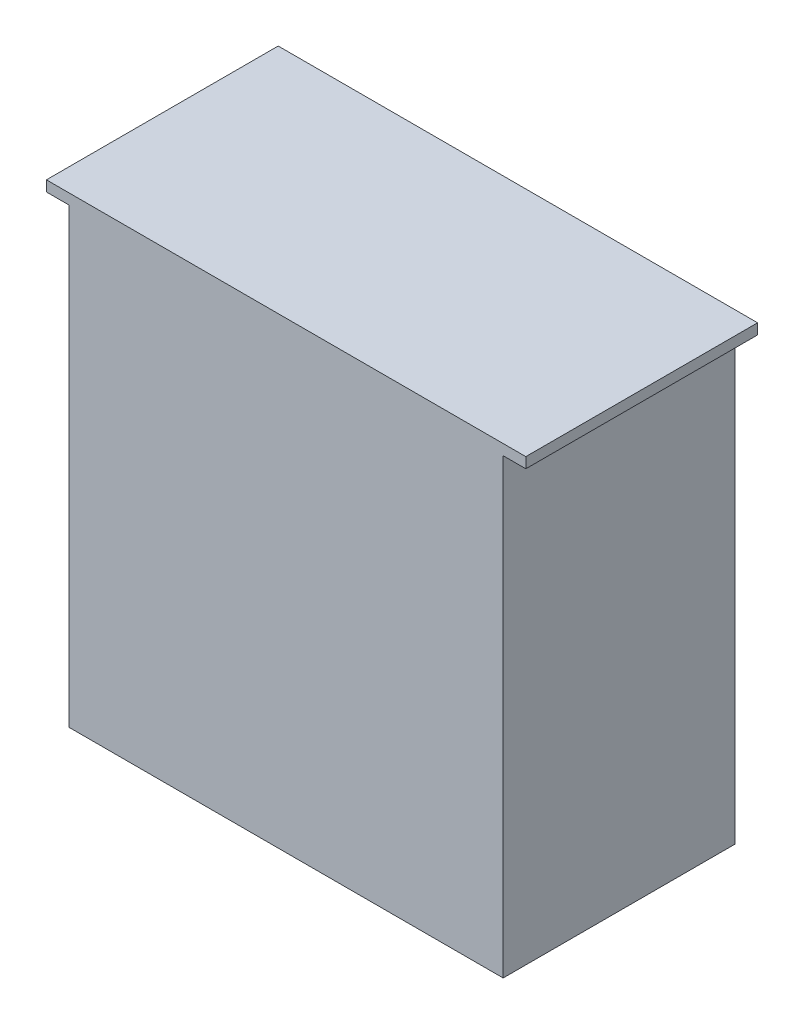
ISO-10303-21;
HEADER;
FILE_DESCRIPTION(('STEP AP214'),'2;1');
FILE_NAME('part.step','',(''),(''),'','','');
FILE_SCHEMA(('AUTOMOTIVE_DESIGN { 1 0 10303 214 1 1 1 1 }'));
ENDSEC;
DATA;
#1=APPLICATION_CONTEXT('core data for automotive mechanical design processes');
#2=APPLICATION_PROTOCOL_DEFINITION('international standard','automotive_design',2000,#1);
#3=PRODUCT_CONTEXT('',#1,'mechanical');
#4=PRODUCT('Part','Part','',(#3));
#5=PRODUCT_RELATED_PRODUCT_CATEGORY('part','',(#4));
#6=PRODUCT_DEFINITION_FORMATION('','',#4);
#7=PRODUCT_DEFINITION_CONTEXT('part definition',#1,'design');
#8=PRODUCT_DEFINITION('design','',#6,#7);
#9=PRODUCT_DEFINITION_SHAPE('','',#8);
#10=(LENGTH_UNIT() NAMED_UNIT(*) SI_UNIT(.MILLI.,.METRE.));
#11=(NAMED_UNIT(*) PLANE_ANGLE_UNIT() SI_UNIT($,.RADIAN.));
#12=(NAMED_UNIT(*) SI_UNIT($,.STERADIAN.) SOLID_ANGLE_UNIT());
#13=UNCERTAINTY_MEASURE_WITH_UNIT(LENGTH_MEASURE(1.E-05),#10,'distance_accuracy_value','');
#14=(GEOMETRIC_REPRESENTATION_CONTEXT(3) GLOBAL_UNCERTAINTY_ASSIGNED_CONTEXT((#13)) GLOBAL_UNIT_ASSIGNED_CONTEXT((#10,
#11,#12)) REPRESENTATION_CONTEXT('',''));
#15=CARTESIAN_POINT('',(0.,0.,0.));
#16=DIRECTION('',(0.,0.,1.));
#17=DIRECTION('',(1.,0.,0.));
#18=AXIS2_PLACEMENT_3D('',#15,#16,#17);
#19=CARTESIAN_POINT('',(-6.56449284,6.68050988,0.));
#20=DIRECTION('',(0.,-1.,0.));
#21=DIRECTION('',(0.,0.,-1.));
#22=AXIS2_PLACEMENT_3D('',#19,#20,#21);
#23=PLANE('',#22);
#24=DIRECTION('',(0.,0.,1.));
#25=VECTOR('',#24,1.);
#26=CARTESIAN_POINT('',(-7.24949274,6.68050988,0.));
#27=LINE('',#26,#25);
#28=CARTESIAN_POINT('',(-7.24949274,6.68050988,0.));
#29=VERTEX_POINT('',#28);
#30=CARTESIAN_POINT('',(-7.24949274,6.68050988,7.01000122));
#31=VERTEX_POINT('',#30);
#32=EDGE_CURVE('E91',#29,#31,#27,.T.);
#33=ORIENTED_EDGE('',*,*,#32,.F.);
#34=DIRECTION('',(1.,0.,0.));
#35=VECTOR('',#34,1.);
#36=CARTESIAN_POINT('',(-6.56449284,6.68050988,0.));
#37=LINE('',#36,#35);
#38=CARTESIAN_POINT('',(-6.56449284,6.68050988,0.));
#39=VERTEX_POINT('',#38);
#40=EDGE_CURVE('E19',#29,#39,#37,.T.);
#41=ORIENTED_EDGE('',*,*,#40,.T.);
#42=DIRECTION('',(0.,0.,1.));
#43=VECTOR('',#42,1.);
#44=CARTESIAN_POINT('',(-6.56449284,6.68050988,0.));
#45=LINE('',#44,#43);
#46=CARTESIAN_POINT('',(-6.56449284,6.68050988,7.01000122));
#47=VERTEX_POINT('',#46);
#48=EDGE_CURVE('E119',#47,#39,#45,.F.);
#49=ORIENTED_EDGE('',*,*,#48,.F.);
#50=DIRECTION('',(-1.,0.,0.));
#51=VECTOR('',#50,1.);
#52=CARTESIAN_POINT('',(-6.56449284,6.68050988,7.01000122));
#53=LINE('',#52,#51);
#54=EDGE_CURVE('E93',#47,#31,#53,.T.);
#55=ORIENTED_EDGE('',*,*,#54,.T.);
#56=EDGE_LOOP('',(#33,#41,#49,#55));
#57=FACE_BOUND('',#56,.T.);
#58=ADVANCED_FACE('F16',(#57),#23,.T.);
#59=CARTESIAN_POINT('',(-7.24949274,6.68050988,0.));
#60=DIRECTION('',(-1.,0.,0.));
#61=DIRECTION('',(0.,0.,1.));
#62=AXIS2_PLACEMENT_3D('',#59,#60,#61);
#63=PLANE('',#62);
#64=DIRECTION('',(0.,0.,1.));
#65=VECTOR('',#64,1.);
#66=CARTESIAN_POINT('',(-7.24949274,6.99949324,0.));
#67=LINE('',#66,#65);
#68=CARTESIAN_POINT('',(-7.24949274,6.99949324,0.));
#69=VERTEX_POINT('',#68);
#70=CARTESIAN_POINT('',(-7.24949274,6.99949324,7.01000122));
#71=VERTEX_POINT('',#70);
#72=EDGE_CURVE('E98',#69,#71,#67,.T.);
#73=ORIENTED_EDGE('',*,*,#72,.F.);
#74=DIRECTION('',(0.,1.,0.));
#75=VECTOR('',#74,1.);
#76=CARTESIAN_POINT('',(-7.24949274,6.68050988,0.));
#77=LINE('',#76,#75);
#78=EDGE_CURVE('E85',#69,#29,#77,.F.);
#79=ORIENTED_EDGE('',*,*,#78,.T.);
#80=ORIENTED_EDGE('',*,*,#32,.T.);
#81=DIRECTION('',(0.,1.,0.));
#82=VECTOR('',#81,1.);
#83=CARTESIAN_POINT('',(-7.24949274,-6.9994907,7.01000122));
#84=LINE('',#83,#82);
#85=EDGE_CURVE('E110',#31,#71,#84,.T.);
#86=ORIENTED_EDGE('',*,*,#85,.T.);
#87=EDGE_LOOP('',(#73,#79,#80,#86));
#88=FACE_BOUND('',#87,.T.);
#89=ADVANCED_FACE('F96',(#88),#63,.T.);
#90=CARTESIAN_POINT('',(7.24949274,6.99949324,0.));
#91=DIRECTION('',(1.,0.,0.));
#92=DIRECTION('',(0.,0.,-1.));
#93=AXIS2_PLACEMENT_3D('',#90,#91,#92);
#94=PLANE('',#93);
#95=DIRECTION('',(0.,0.,-1.));
#96=VECTOR('',#95,1.);
#97=CARTESIAN_POINT('',(7.24949274,6.68050988,0.));
#98=LINE('',#97,#96);
#99=CARTESIAN_POINT('',(7.24949274,6.68050988,0.));
#100=VERTEX_POINT('',#99);
#101=CARTESIAN_POINT('',(7.24949274,6.68050988,7.01000122));
#102=VERTEX_POINT('',#101);
#103=EDGE_CURVE('E101',#100,#102,#98,.F.);
#104=ORIENTED_EDGE('',*,*,#103,.F.);
#105=DIRECTION('',(0.,1.,0.));
#106=VECTOR('',#105,1.);
#107=CARTESIAN_POINT('',(7.24949274,6.99949324,0.));
#108=LINE('',#107,#106);
#109=CARTESIAN_POINT('',(7.24949274,6.99949324,0.));
#110=VERTEX_POINT('',#109);
#111=EDGE_CURVE('E77',#100,#110,#108,.T.);
#112=ORIENTED_EDGE('',*,*,#111,.T.);
#113=DIRECTION('',(0.,0.,1.));
#114=VECTOR('',#113,1.);
#115=CARTESIAN_POINT('',(7.24949274,6.99949324,0.));
#116=LINE('',#115,#114);
#117=CARTESIAN_POINT('',(7.24949274,6.99949324,7.01000122));
#118=VERTEX_POINT('',#117);
#119=EDGE_CURVE('E125',#118,#110,#116,.F.);
#120=ORIENTED_EDGE('',*,*,#119,.F.);
#121=DIRECTION('',(0.,1.,0.));
#122=VECTOR('',#121,1.);
#123=CARTESIAN_POINT('',(7.24949274,-6.9994907,7.01000122));
#124=LINE('',#123,#122);
#125=EDGE_CURVE('E112',#118,#102,#124,.F.);
#126=ORIENTED_EDGE('',*,*,#125,.T.);
#127=EDGE_LOOP('',(#104,#112,#120,#126));
#128=FACE_BOUND('',#127,.T.);
#129=ADVANCED_FACE('F220',(#128),#94,.T.);
#130=CARTESIAN_POINT('',(7.24949274,6.68050988,0.));
#131=DIRECTION('',(0.,-1.,0.));
#132=DIRECTION('',(0.,0.,-1.));
#133=AXIS2_PLACEMENT_3D('',#130,#131,#132);
#134=PLANE('',#133);
#135=DIRECTION('',(0.,0.,-1.));
#136=VECTOR('',#135,1.);
#137=CARTESIAN_POINT('',(6.56449284,6.68050988,0.));
#138=LINE('',#137,#136);
#139=CARTESIAN_POINT('',(6.56449284,6.68050988,0.));
#140=VERTEX_POINT('',#139);
#141=CARTESIAN_POINT('',(6.56449284,6.68050988,7.01000122));
#142=VERTEX_POINT('',#141);
#143=EDGE_CURVE('E128',#140,#142,#138,.F.);
#144=ORIENTED_EDGE('',*,*,#143,.F.);
#145=DIRECTION('',(1.,0.,0.));
#146=VECTOR('',#145,1.);
#147=CARTESIAN_POINT('',(7.24949274,6.68050988,0.));
#148=LINE('',#147,#146);
#149=EDGE_CURVE('E106',#140,#100,#148,.T.);
#150=ORIENTED_EDGE('',*,*,#149,.T.);
#151=ORIENTED_EDGE('',*,*,#103,.T.);
#152=DIRECTION('',(-1.,0.,0.));
#153=VECTOR('',#152,1.);
#154=CARTESIAN_POINT('',(-6.56449284,6.68050988,7.01000122));
#155=LINE('',#154,#153);
#156=EDGE_CURVE('E114',#102,#142,#155,.T.);
#157=ORIENTED_EDGE('',*,*,#156,.T.);
#158=EDGE_LOOP('',(#144,#150,#151,#157));
#159=FACE_BOUND('',#158,.T.);
#160=ADVANCED_FACE('F148',(#159),#134,.T.);
#161=CARTESIAN_POINT('',(-6.56449284,-6.9994907,7.01000122));
#162=DIRECTION('',(0.,0.,-1.));
#163=DIRECTION('',(-1.,0.,0.));
#164=AXIS2_PLACEMENT_3D('',#161,#162,#163);
#165=PLANE('',#164);
#166=DIRECTION('',(0.,1.,0.));
#167=VECTOR('',#166,1.);
#168=CARTESIAN_POINT('',(6.56449284,6.68050988,7.01000122));
#169=LINE('',#168,#167);
#170=CARTESIAN_POINT('',(6.56449284,-6.9994907,7.01000122));
#171=VERTEX_POINT('',#170);
#172=EDGE_CURVE('E131',#142,#171,#169,.F.);
#173=ORIENTED_EDGE('',*,*,#172,.F.);
#174=ORIENTED_EDGE('',*,*,#156,.F.);
#175=ORIENTED_EDGE('',*,*,#125,.F.);
#176=DIRECTION('',(1.,0.,0.));
#177=VECTOR('',#176,1.);
#178=CARTESIAN_POINT('',(-7.24949274,6.99949324,7.01000122));
#179=LINE('',#178,#177);
#180=EDGE_CURVE('E122',#71,#118,#179,.T.);
#181=ORIENTED_EDGE('',*,*,#180,.F.);
#182=ORIENTED_EDGE('',*,*,#85,.F.);
#183=ORIENTED_EDGE('',*,*,#54,.F.);
#184=DIRECTION('',(0.,1.,0.));
#185=VECTOR('',#184,1.);
#186=CARTESIAN_POINT('',(-6.56449284,-6.9994907,7.01000122));
#187=LINE('',#186,#185);
#188=CARTESIAN_POINT('',(-6.56449284,-6.9994907,7.01000122));
#189=VERTEX_POINT('',#188);
#190=EDGE_CURVE('E116',#189,#47,#187,.T.);
#191=ORIENTED_EDGE('',*,*,#190,.F.);
#192=DIRECTION('',(1.,0.,0.));
#193=VECTOR('',#192,1.);
#194=CARTESIAN_POINT('',(6.56449284,-6.9994907,7.01000122));
#195=LINE('',#194,#193);
#196=EDGE_CURVE('E134',#171,#189,#195,.F.);
#197=ORIENTED_EDGE('',*,*,#196,.F.);
#198=EDGE_LOOP('',(#173,#174,#175,#181,#182,#183,#191,#197));
#199=FACE_BOUND('',#198,.T.);
#200=ADVANCED_FACE('F151',(#199),#165,.F.);
#201=CARTESIAN_POINT('',(-6.56449284,-6.9994907,0.));
#202=DIRECTION('',(-1.,0.,0.));
#203=DIRECTION('',(0.,0.,1.));
#204=AXIS2_PLACEMENT_3D('',#201,#202,#203);
#205=PLANE('',#204);
#206=ORIENTED_EDGE('',*,*,#48,.T.);
#207=DIRECTION('',(0.,1.,0.));
#208=VECTOR('',#207,1.);
#209=CARTESIAN_POINT('',(-6.56449284,-6.9994907,0.));
#210=LINE('',#209,#208);
#211=CARTESIAN_POINT('',(-6.56449284,-6.9994907,0.));
#212=VERTEX_POINT('',#211);
#213=EDGE_CURVE('E87',#212,#39,#210,.T.);
#214=ORIENTED_EDGE('',*,*,#213,.F.);
#215=DIRECTION('',(0.,0.,-1.));
#216=VECTOR('',#215,1.);
#217=CARTESIAN_POINT('',(-6.56449284,-6.9994907,0.));
#218=LINE('',#217,#216);
#219=EDGE_CURVE('E137',#189,#212,#218,.T.);
#220=ORIENTED_EDGE('',*,*,#219,.F.);
#221=ORIENTED_EDGE('',*,*,#190,.T.);
#222=EDGE_LOOP('',(#206,#214,#220,#221));
#223=FACE_BOUND('',#222,.T.);
#224=ADVANCED_FACE('F156',(#223),#205,.T.);
#225=CARTESIAN_POINT('',(-7.24949274,6.99949324,0.));
#226=DIRECTION('',(0.,1.,0.));
#227=DIRECTION('',(0.,0.,1.));
#228=AXIS2_PLACEMENT_3D('',#225,#226,#227);
#229=PLANE('',#228);
#230=ORIENTED_EDGE('',*,*,#119,.T.);
#231=DIRECTION('',(-1.,0.,0.));
#232=VECTOR('',#231,1.);
#233=CARTESIAN_POINT('',(-6.56449284,6.99949324,0.));
#234=LINE('',#233,#232);
#235=EDGE_CURVE('E141',#69,#110,#234,.F.);
#236=ORIENTED_EDGE('',*,*,#235,.F.);
#237=ORIENTED_EDGE('',*,*,#72,.T.);
#238=ORIENTED_EDGE('',*,*,#180,.T.);
#239=EDGE_LOOP('',(#230,#236,#237,#238));
#240=FACE_BOUND('',#239,.T.);
#241=ADVANCED_FACE('F158',(#240),#229,.T.);
#242=CARTESIAN_POINT('',(6.56449284,6.68050988,0.));
#243=DIRECTION('',(1.,0.,0.));
#244=DIRECTION('',(0.,0.,-1.));
#245=AXIS2_PLACEMENT_3D('',#242,#243,#244);
#246=PLANE('',#245);
#247=DIRECTION('',(0.,0.,-1.));
#248=VECTOR('',#247,1.);
#249=CARTESIAN_POINT('',(6.56449284,-6.9994907,0.));
#250=LINE('',#249,#248);
#251=CARTESIAN_POINT('',(6.56449284,-6.9994907,0.));
#252=VERTEX_POINT('',#251);
#253=EDGE_CURVE('E34',#252,#171,#250,.F.);
#254=ORIENTED_EDGE('',*,*,#253,.F.);
#255=DIRECTION('',(0.,1.,0.));
#256=VECTOR('',#255,1.);
#257=CARTESIAN_POINT('',(6.56449284,-6.9994907,0.));
#258=LINE('',#257,#256);
#259=EDGE_CURVE('E25',#140,#252,#258,.F.);
#260=ORIENTED_EDGE('',*,*,#259,.F.);
#261=ORIENTED_EDGE('',*,*,#143,.T.);
#262=ORIENTED_EDGE('',*,*,#172,.T.);
#263=EDGE_LOOP('',(#254,#260,#261,#262));
#264=FACE_BOUND('',#263,.T.);
#265=ADVANCED_FACE('F144',(#264),#246,.T.);
#266=CARTESIAN_POINT('',(6.56449284,-6.9994907,0.));
#267=DIRECTION('',(0.,-1.,0.));
#268=DIRECTION('',(0.,0.,-1.));
#269=AXIS2_PLACEMENT_3D('',#266,#267,#268);
#270=PLANE('',#269);
#271=ORIENTED_EDGE('',*,*,#219,.T.);
#272=DIRECTION('',(-1.,0.,0.));
#273=VECTOR('',#272,1.);
#274=CARTESIAN_POINT('',(-6.56449284,-6.9994907,0.));
#275=LINE('',#274,#273);
#276=EDGE_CURVE('E10',#252,#212,#275,.T.);
#277=ORIENTED_EDGE('',*,*,#276,.F.);
#278=ORIENTED_EDGE('',*,*,#253,.T.);
#279=ORIENTED_EDGE('',*,*,#196,.T.);
#280=EDGE_LOOP('',(#271,#277,#278,#279));
#281=FACE_BOUND('',#280,.T.);
#282=ADVANCED_FACE('F154',(#281),#270,.T.);
#283=CARTESIAN_POINT('',(-6.56449284,-6.9994907,0.));
#284=DIRECTION('',(0.,0.,-1.));
#285=DIRECTION('',(-1.,0.,0.));
#286=AXIS2_PLACEMENT_3D('',#283,#284,#285);
#287=PLANE('',#286);
#288=ORIENTED_EDGE('',*,*,#259,.T.);
#289=ORIENTED_EDGE('',*,*,#276,.T.);
#290=ORIENTED_EDGE('',*,*,#213,.T.);
#291=ORIENTED_EDGE('',*,*,#40,.F.);
#292=ORIENTED_EDGE('',*,*,#78,.F.);
#293=ORIENTED_EDGE('',*,*,#235,.T.);
#294=ORIENTED_EDGE('',*,*,#111,.F.);
#295=ORIENTED_EDGE('',*,*,#149,.F.);
#296=EDGE_LOOP('',(#288,#289,#290,#291,#292,#293,#294,#295));
#297=FACE_BOUND('',#296,.T.);
#298=ADVANCED_FACE('F83',(#297),#287,.T.);
#299=CLOSED_SHELL('',(#58,#89,#129,#160,#200,#224,#241,#265,#282,#298));
#300=MANIFOLD_SOLID_BREP('B1',#299);
#301=ADVANCED_BREP_SHAPE_REPRESENTATION('',(#18,#300),#14);
#302=SHAPE_DEFINITION_REPRESENTATION(#9,#301);
ENDSEC;
END-ISO-10303-21;
